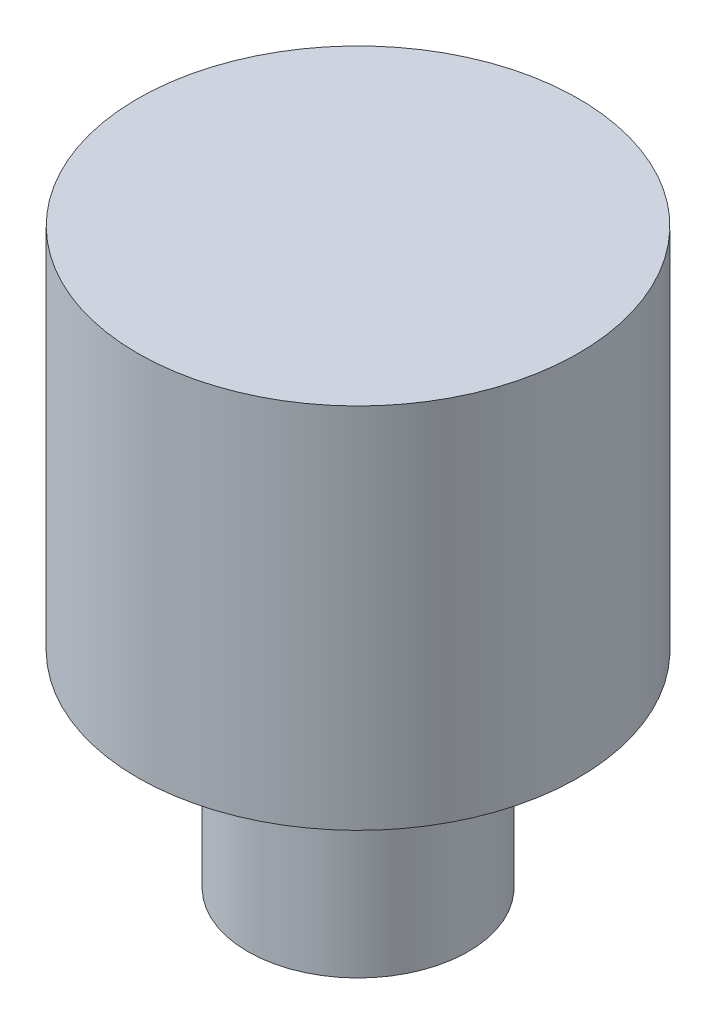
ISO-10303-21;
HEADER;
FILE_DESCRIPTION(('STEP AP214'),'2;1');
FILE_NAME('part.step','',(''),(''),'','','');
FILE_SCHEMA(('AUTOMOTIVE_DESIGN { 1 0 10303 214 1 1 1 1 }'));
ENDSEC;
DATA;
#1=APPLICATION_CONTEXT('core data for automotive mechanical design processes');
#2=APPLICATION_PROTOCOL_DEFINITION('international standard','automotive_design',2000,#1);
#3=PRODUCT_CONTEXT('',#1,'mechanical');
#4=PRODUCT('Part','Part','',(#3));
#5=PRODUCT_RELATED_PRODUCT_CATEGORY('part','',(#4));
#6=PRODUCT_DEFINITION_FORMATION('','',#4);
#7=PRODUCT_DEFINITION_CONTEXT('part definition',#1,'design');
#8=PRODUCT_DEFINITION('design','',#6,#7);
#9=PRODUCT_DEFINITION_SHAPE('','',#8);
#10=(LENGTH_UNIT() NAMED_UNIT(*) SI_UNIT(.MILLI.,.METRE.));
#11=(NAMED_UNIT(*) PLANE_ANGLE_UNIT() SI_UNIT($,.RADIAN.));
#12=(NAMED_UNIT(*) SI_UNIT($,.STERADIAN.) SOLID_ANGLE_UNIT());
#13=UNCERTAINTY_MEASURE_WITH_UNIT(LENGTH_MEASURE(1.E-05),#10,'distance_accuracy_value','');
#14=(GEOMETRIC_REPRESENTATION_CONTEXT(3) GLOBAL_UNCERTAINTY_ASSIGNED_CONTEXT((#13)) GLOBAL_UNIT_ASSIGNED_CONTEXT((#10,
#11,#12)) REPRESENTATION_CONTEXT('',''));
#15=CARTESIAN_POINT('',(0.,0.,0.));
#16=DIRECTION('',(0.,0.,1.));
#17=DIRECTION('',(1.,0.,0.));
#18=AXIS2_PLACEMENT_3D('',#15,#16,#17);
#19=CARTESIAN_POINT('',(0.,2.8,0.));
#20=DIRECTION('',(0.,-1.,0.));
#21=DIRECTION('',(0.,0.,-1.));
#22=AXIS2_PLACEMENT_3D('',#19,#20,#21);
#23=CYLINDRICAL_SURFACE('',#22,1.5);
#24=CARTESIAN_POINT('',(0.,2.8,0.));
#25=DIRECTION('',(0.,1.,0.));
#26=DIRECTION('',(0.,0.,1.));
#27=AXIS2_PLACEMENT_3D('',#24,#25,#26);
#28=CIRCLE('',#27,1.5);
#29=CARTESIAN_POINT('',(0.,2.8,1.5));
#30=VERTEX_POINT('',#29);
#31=EDGE_CURVE('E10',#30,#30,#28,.T.);
#32=ORIENTED_EDGE('',*,*,#31,.F.);
#33=EDGE_LOOP('',(#32));
#34=FACE_BOUND('',#33,.T.);
#35=CARTESIAN_POINT('',(0.,0.,0.));
#36=DIRECTION('',(0.,1.,0.));
#37=DIRECTION('',(0.,0.,1.));
#38=AXIS2_PLACEMENT_3D('',#35,#36,#37);
#39=CIRCLE('',#38,1.5);
#40=CARTESIAN_POINT('',(0.,0.,1.5));
#41=VERTEX_POINT('',#40);
#42=EDGE_CURVE('E40',#41,#41,#39,.T.);
#43=ORIENTED_EDGE('',*,*,#42,.T.);
#44=EDGE_LOOP('',(#43));
#45=FACE_BOUND('',#44,.T.);
#46=ADVANCED_FACE('F37',(#34,#45),#23,.T.);
#47=CARTESIAN_POINT('',(0.,0.,0.));
#48=DIRECTION('',(0.,1.,0.));
#49=DIRECTION('',(0.,0.,1.));
#50=AXIS2_PLACEMENT_3D('',#47,#48,#49);
#51=PLANE('',#50);
#52=ORIENTED_EDGE('',*,*,#42,.F.);
#53=EDGE_LOOP('',(#52));
#54=FACE_BOUND('',#53,.T.);
#55=ADVANCED_FACE('F64',(#54),#51,.F.);
#56=CARTESIAN_POINT('',(0.,7.8,0.));
#57=DIRECTION('',(0.,-1.,0.));
#58=DIRECTION('',(0.,0.,-1.));
#59=AXIS2_PLACEMENT_3D('',#56,#57,#58);
#60=CYLINDRICAL_SURFACE('',#59,3.);
#61=CARTESIAN_POINT('',(0.,7.8,0.));
#62=DIRECTION('',(0.,1.,0.));
#63=DIRECTION('',(0.,0.,1.));
#64=AXIS2_PLACEMENT_3D('',#61,#62,#63);
#65=CIRCLE('',#64,3.);
#66=CARTESIAN_POINT('',(0.,7.8,3.));
#67=VERTEX_POINT('',#66);
#68=EDGE_CURVE('E49',#67,#67,#65,.T.);
#69=ORIENTED_EDGE('',*,*,#68,.F.);
#70=EDGE_LOOP('',(#69));
#71=FACE_BOUND('',#70,.T.);
#72=CARTESIAN_POINT('',(0.,2.8,0.));
#73=DIRECTION('',(0.,1.,0.));
#74=DIRECTION('',(0.,0.,1.));
#75=AXIS2_PLACEMENT_3D('',#72,#73,#74);
#76=CIRCLE('',#75,3.);
#77=CARTESIAN_POINT('',(0.,2.8,3.));
#78=VERTEX_POINT('',#77);
#79=EDGE_CURVE('E51',#78,#78,#76,.T.);
#80=ORIENTED_EDGE('',*,*,#79,.T.);
#81=EDGE_LOOP('',(#80));
#82=FACE_BOUND('',#81,.T.);
#83=ADVANCED_FACE('F61',(#71,#82),#60,.T.);
#84=CARTESIAN_POINT('',(0.,7.8,0.));
#85=DIRECTION('',(0.,1.,0.));
#86=DIRECTION('',(0.,0.,1.));
#87=AXIS2_PLACEMENT_3D('',#84,#85,#86);
#88=PLANE('',#87);
#89=ORIENTED_EDGE('',*,*,#68,.T.);
#90=EDGE_LOOP('',(#89));
#91=FACE_BOUND('',#90,.T.);
#92=ADVANCED_FACE('F59',(#91),#88,.T.);
#93=CARTESIAN_POINT('',(0.,2.8,0.));
#94=DIRECTION('',(0.,1.,0.));
#95=DIRECTION('',(0.,0.,1.));
#96=AXIS2_PLACEMENT_3D('',#93,#94,#95);
#97=PLANE('',#96);
#98=ORIENTED_EDGE('',*,*,#31,.T.);
#99=EDGE_LOOP('',(#98));
#100=FACE_BOUND('',#99,.T.);
#101=ORIENTED_EDGE('',*,*,#79,.F.);
#102=EDGE_LOOP('',(#101));
#103=FACE_BOUND('',#102,.T.);
#104=ADVANCED_FACE('F68',(#100,#103),#97,.F.);
#105=CLOSED_SHELL('',(#46,#55,#83,#92,#104));
#106=MANIFOLD_SOLID_BREP('B2',#105);
#107=ADVANCED_BREP_SHAPE_REPRESENTATION('',(#18,#106),#14);
#108=SHAPE_DEFINITION_REPRESENTATION(#9,#107);
ENDSEC;
END-ISO-10303-21;
